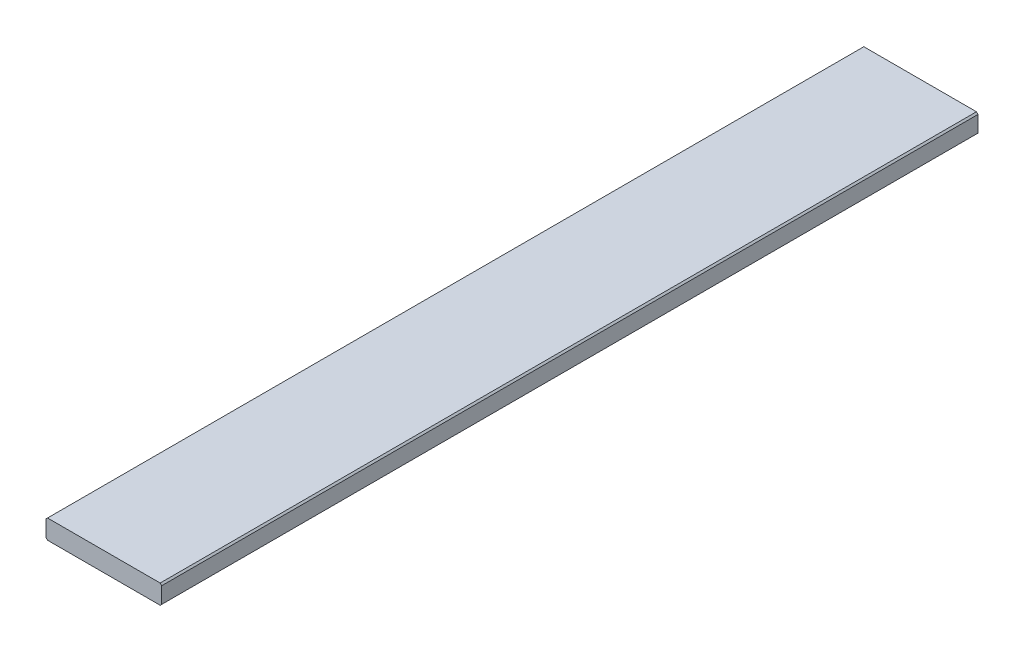
ISO-10303-21;
HEADER;
FILE_DESCRIPTION(('STEP AP214'),'2;1');
FILE_NAME('part.step','',(''),(''),'','','');
FILE_SCHEMA(('AUTOMOTIVE_DESIGN { 1 0 10303 214 1 1 1 1 }'));
ENDSEC;
DATA;
#1=APPLICATION_CONTEXT('core data for automotive mechanical design processes');
#2=APPLICATION_PROTOCOL_DEFINITION('international standard','automotive_design',2000,#1);
#3=PRODUCT_CONTEXT('',#1,'mechanical');
#4=PRODUCT('Part','Part','',(#3));
#5=PRODUCT_RELATED_PRODUCT_CATEGORY('part','',(#4));
#6=PRODUCT_DEFINITION_FORMATION('','',#4);
#7=PRODUCT_DEFINITION_CONTEXT('part definition',#1,'design');
#8=PRODUCT_DEFINITION('design','',#6,#7);
#9=PRODUCT_DEFINITION_SHAPE('','',#8);
#10=(LENGTH_UNIT() NAMED_UNIT(*) SI_UNIT(.MILLI.,.METRE.));
#11=(NAMED_UNIT(*) PLANE_ANGLE_UNIT() SI_UNIT($,.RADIAN.));
#12=(NAMED_UNIT(*) SI_UNIT($,.STERADIAN.) SOLID_ANGLE_UNIT());
#13=UNCERTAINTY_MEASURE_WITH_UNIT(LENGTH_MEASURE(1.E-05),#10,'distance_accuracy_value','');
#14=(GEOMETRIC_REPRESENTATION_CONTEXT(3) GLOBAL_UNCERTAINTY_ASSIGNED_CONTEXT((#13)) GLOBAL_UNIT_ASSIGNED_CONTEXT((#10,
#11,#12)) REPRESENTATION_CONTEXT('',''));
#15=CARTESIAN_POINT('',(0.,0.,0.));
#16=DIRECTION('',(0.,0.,1.));
#17=DIRECTION('',(1.,0.,0.));
#18=AXIS2_PLACEMENT_3D('',#15,#16,#17);
#19=CARTESIAN_POINT('',(-73.,12.5,1058.));
#20=DIRECTION('',(0.,-1.,0.));
#21=DIRECTION('',(0.,0.,-1.));
#22=AXIS2_PLACEMENT_3D('',#19,#20,#21);
#23=PLANE('',#22);
#24=DIRECTION('',(-1.,0.,0.));
#25=VECTOR('',#24,1.);
#26=CARTESIAN_POINT('',(-73.,12.5,0.));
#27=LINE('',#26,#25);
#28=CARTESIAN_POINT('',(73.,12.5,0.));
#29=VERTEX_POINT('',#28);
#30=CARTESIAN_POINT('',(-73.,12.5,0.));
#31=VERTEX_POINT('',#30);
#32=EDGE_CURVE('E130',#29,#31,#27,.T.);
#33=ORIENTED_EDGE('',*,*,#32,.T.);
#34=DIRECTION('',(0.,0.,-1.));
#35=VECTOR('',#34,1.);
#36=CARTESIAN_POINT('',(-73.,12.5,1058.));
#37=LINE('',#36,#35);
#38=CARTESIAN_POINT('',(-73.,12.5,1058.));
#39=VERTEX_POINT('',#38);
#40=EDGE_CURVE('E11',#39,#31,#37,.T.);
#41=ORIENTED_EDGE('',*,*,#40,.F.);
#42=DIRECTION('',(-1.,0.,0.));
#43=VECTOR('',#42,1.);
#44=CARTESIAN_POINT('',(-73.,12.5,1058.));
#45=LINE('',#44,#43);
#46=CARTESIAN_POINT('',(73.,12.5,1058.));
#47=VERTEX_POINT('',#46);
#48=EDGE_CURVE('E144',#47,#39,#45,.T.);
#49=ORIENTED_EDGE('',*,*,#48,.F.);
#50=DIRECTION('',(0.,0.,-1.));
#51=VECTOR('',#50,1.);
#52=CARTESIAN_POINT('',(73.,12.5,1058.));
#53=LINE('',#52,#51);
#54=EDGE_CURVE('E126',#47,#29,#53,.T.);
#55=ORIENTED_EDGE('',*,*,#54,.T.);
#56=EDGE_LOOP('',(#33,#41,#49,#55));
#57=FACE_BOUND('',#56,.T.);
#58=ADVANCED_FACE('F34',(#57),#23,.F.);
#59=CARTESIAN_POINT('',(-75.,10.5,1058.));
#60=DIRECTION('',(0.707106781186547,-0.707106781186548,0.));
#61=DIRECTION('',(0.707106781186548,0.707106781186547,0.));
#62=AXIS2_PLACEMENT_3D('',#59,#60,#61);
#63=PLANE('',#62);
#64=DIRECTION('',(-0.707106781186548,-0.707106781186547,0.));
#65=VECTOR('',#64,1.);
#66=CARTESIAN_POINT('',(-75.,10.5,0.));
#67=LINE('',#66,#65);
#68=CARTESIAN_POINT('',(-75.,10.5,0.));
#69=VERTEX_POINT('',#68);
#70=EDGE_CURVE('E133',#31,#69,#67,.T.);
#71=ORIENTED_EDGE('',*,*,#70,.T.);
#72=DIRECTION('',(0.,0.,-1.));
#73=VECTOR('',#72,1.);
#74=CARTESIAN_POINT('',(-75.,10.5,1058.));
#75=LINE('',#74,#73);
#76=CARTESIAN_POINT('',(-75.,10.5,1058.));
#77=VERTEX_POINT('',#76);
#78=EDGE_CURVE('E42',#77,#69,#75,.T.);
#79=ORIENTED_EDGE('',*,*,#78,.F.);
#80=DIRECTION('',(-0.707106781186548,-0.707106781186547,0.));
#81=VECTOR('',#80,1.);
#82=CARTESIAN_POINT('',(-75.,10.5,1058.));
#83=LINE('',#82,#81);
#84=EDGE_CURVE('E93',#39,#77,#83,.T.);
#85=ORIENTED_EDGE('',*,*,#84,.F.);
#86=ORIENTED_EDGE('',*,*,#40,.T.);
#87=EDGE_LOOP('',(#71,#79,#85,#86));
#88=FACE_BOUND('',#87,.T.);
#89=ADVANCED_FACE('F179',(#88),#63,.F.);
#90=CARTESIAN_POINT('',(-75.,10.5,1058.));
#91=DIRECTION('',(1.,0.,0.));
#92=DIRECTION('',(0.,0.,-1.));
#93=AXIS2_PLACEMENT_3D('',#90,#91,#92);
#94=PLANE('',#93);
#95=DIRECTION('',(0.,-1.,0.));
#96=VECTOR('',#95,1.);
#97=CARTESIAN_POINT('',(-75.,10.5,0.));
#98=LINE('',#97,#96);
#99=CARTESIAN_POINT('',(-75.,-10.5,0.));
#100=VERTEX_POINT('',#99);
#101=EDGE_CURVE('E135',#69,#100,#98,.T.);
#102=ORIENTED_EDGE('',*,*,#101,.T.);
#103=DIRECTION('',(0.,0.,-1.));
#104=VECTOR('',#103,1.);
#105=CARTESIAN_POINT('',(-75.,-10.5,1058.));
#106=LINE('',#105,#104);
#107=CARTESIAN_POINT('',(-75.,-10.5,1058.));
#108=VERTEX_POINT('',#107);
#109=EDGE_CURVE('E151',#108,#100,#106,.T.);
#110=ORIENTED_EDGE('',*,*,#109,.F.);
#111=DIRECTION('',(0.,-1.,0.));
#112=VECTOR('',#111,1.);
#113=CARTESIAN_POINT('',(-75.,10.5,1058.));
#114=LINE('',#113,#112);
#115=EDGE_CURVE('E159',#77,#108,#114,.T.);
#116=ORIENTED_EDGE('',*,*,#115,.F.);
#117=ORIENTED_EDGE('',*,*,#78,.T.);
#118=EDGE_LOOP('',(#102,#110,#116,#117));
#119=FACE_BOUND('',#118,.T.);
#120=ADVANCED_FACE('F157',(#119),#94,.F.);
#121=CARTESIAN_POINT('',(-75.,-10.5,1058.));
#122=DIRECTION('',(0.707106781186547,0.707106781186548,0.));
#123=DIRECTION('',(-0.707106781186548,0.707106781186547,0.));
#124=AXIS2_PLACEMENT_3D('',#121,#122,#123);
#125=PLANE('',#124);
#126=DIRECTION('',(0.707106781186548,-0.707106781186547,0.));
#127=VECTOR('',#126,1.);
#128=CARTESIAN_POINT('',(-75.,-10.5,0.));
#129=LINE('',#128,#127);
#130=CARTESIAN_POINT('',(-73.,-12.5,0.));
#131=VERTEX_POINT('',#130);
#132=EDGE_CURVE('E137',#100,#131,#129,.T.);
#133=ORIENTED_EDGE('',*,*,#132,.T.);
#134=DIRECTION('',(0.,0.,-1.));
#135=VECTOR('',#134,1.);
#136=CARTESIAN_POINT('',(-73.,-12.5,1058.));
#137=LINE('',#136,#135);
#138=CARTESIAN_POINT('',(-73.,-12.5,1058.));
#139=VERTEX_POINT('',#138);
#140=EDGE_CURVE('E148',#139,#131,#137,.T.);
#141=ORIENTED_EDGE('',*,*,#140,.F.);
#142=DIRECTION('',(0.707106781186548,-0.707106781186547,0.));
#143=VECTOR('',#142,1.);
#144=CARTESIAN_POINT('',(-75.,-10.5,1058.));
#145=LINE('',#144,#143);
#146=EDGE_CURVE('E171',#108,#139,#145,.T.);
#147=ORIENTED_EDGE('',*,*,#146,.F.);
#148=ORIENTED_EDGE('',*,*,#109,.T.);
#149=EDGE_LOOP('',(#133,#141,#147,#148));
#150=FACE_BOUND('',#149,.T.);
#151=ADVANCED_FACE('F167',(#150),#125,.F.);
#152=CARTESIAN_POINT('',(-73.,-12.5,1058.));
#153=DIRECTION('',(0.,1.,0.));
#154=DIRECTION('',(0.,0.,1.));
#155=AXIS2_PLACEMENT_3D('',#152,#153,#154);
#156=PLANE('',#155);
#157=DIRECTION('',(1.,0.,0.));
#158=VECTOR('',#157,1.);
#159=CARTESIAN_POINT('',(-73.,-12.5,0.));
#160=LINE('',#159,#158);
#161=CARTESIAN_POINT('',(73.,-12.5,0.));
#162=VERTEX_POINT('',#161);
#163=EDGE_CURVE('E139',#131,#162,#160,.T.);
#164=ORIENTED_EDGE('',*,*,#163,.T.);
#165=DIRECTION('',(0.,0.,-1.));
#166=VECTOR('',#165,1.);
#167=CARTESIAN_POINT('',(73.,-12.5,1058.));
#168=LINE('',#167,#166);
#169=CARTESIAN_POINT('',(73.,-12.5,1058.));
#170=VERTEX_POINT('',#169);
#171=EDGE_CURVE('E121',#170,#162,#168,.T.);
#172=ORIENTED_EDGE('',*,*,#171,.F.);
#173=DIRECTION('',(1.,0.,0.));
#174=VECTOR('',#173,1.);
#175=CARTESIAN_POINT('',(-73.,-12.5,1058.));
#176=LINE('',#175,#174);
#177=EDGE_CURVE('E112',#139,#170,#176,.T.);
#178=ORIENTED_EDGE('',*,*,#177,.F.);
#179=ORIENTED_EDGE('',*,*,#140,.T.);
#180=EDGE_LOOP('',(#164,#172,#178,#179));
#181=FACE_BOUND('',#180,.T.);
#182=ADVANCED_FACE('F170',(#181),#156,.F.);
#183=CARTESIAN_POINT('',(73.,-12.5,1058.));
#184=DIRECTION('',(-0.707106781186547,0.707106781186548,0.));
#185=DIRECTION('',(-0.707106781186548,-0.707106781186547,0.));
#186=AXIS2_PLACEMENT_3D('',#183,#184,#185);
#187=PLANE('',#186);
#188=DIRECTION('',(0.707106781186548,0.707106781186547,0.));
#189=VECTOR('',#188,1.);
#190=CARTESIAN_POINT('',(73.,-12.5,0.));
#191=LINE('',#190,#189);
#192=CARTESIAN_POINT('',(75.,-10.5,0.));
#193=VERTEX_POINT('',#192);
#194=EDGE_CURVE('E120',#162,#193,#191,.T.);
#195=ORIENTED_EDGE('',*,*,#194,.T.);
#196=DIRECTION('',(0.,0.,-1.));
#197=VECTOR('',#196,1.);
#198=CARTESIAN_POINT('',(75.,-10.5,1058.));
#199=LINE('',#198,#197);
#200=CARTESIAN_POINT('',(75.,-10.5,1058.));
#201=VERTEX_POINT('',#200);
#202=EDGE_CURVE('E117',#201,#193,#199,.T.);
#203=ORIENTED_EDGE('',*,*,#202,.F.);
#204=DIRECTION('',(0.707106781186548,0.707106781186547,0.));
#205=VECTOR('',#204,1.);
#206=CARTESIAN_POINT('',(73.,-12.5,1058.));
#207=LINE('',#206,#205);
#208=EDGE_CURVE('E106',#170,#201,#207,.T.);
#209=ORIENTED_EDGE('',*,*,#208,.F.);
#210=ORIENTED_EDGE('',*,*,#171,.T.);
#211=EDGE_LOOP('',(#195,#203,#209,#210));
#212=FACE_BOUND('',#211,.T.);
#213=ADVANCED_FACE('F118',(#212),#187,.F.);
#214=CARTESIAN_POINT('',(75.,10.5,1058.));
#215=DIRECTION('',(-1.,0.,0.));
#216=DIRECTION('',(0.,0.,1.));
#217=AXIS2_PLACEMENT_3D('',#214,#215,#216);
#218=PLANE('',#217);
#219=DIRECTION('',(0.,1.,0.));
#220=VECTOR('',#219,1.);
#221=CARTESIAN_POINT('',(75.,10.5,0.));
#222=LINE('',#221,#220);
#223=CARTESIAN_POINT('',(75.,10.5,0.));
#224=VERTEX_POINT('',#223);
#225=EDGE_CURVE('E79',#193,#224,#222,.T.);
#226=ORIENTED_EDGE('',*,*,#225,.T.);
#227=DIRECTION('',(0.,0.,-1.));
#228=VECTOR('',#227,1.);
#229=CARTESIAN_POINT('',(75.,10.5,1058.));
#230=LINE('',#229,#228);
#231=CARTESIAN_POINT('',(75.,10.5,1058.));
#232=VERTEX_POINT('',#231);
#233=EDGE_CURVE('E122',#232,#224,#230,.T.);
#234=ORIENTED_EDGE('',*,*,#233,.F.);
#235=DIRECTION('',(0.,1.,0.));
#236=VECTOR('',#235,1.);
#237=CARTESIAN_POINT('',(75.,10.5,1058.));
#238=LINE('',#237,#236);
#239=EDGE_CURVE('E110',#201,#232,#238,.T.);
#240=ORIENTED_EDGE('',*,*,#239,.F.);
#241=ORIENTED_EDGE('',*,*,#202,.T.);
#242=EDGE_LOOP('',(#226,#234,#240,#241));
#243=FACE_BOUND('',#242,.T.);
#244=ADVANCED_FACE('F124',(#243),#218,.F.);
#245=CARTESIAN_POINT('',(73.,12.5,1058.));
#246=DIRECTION('',(-0.707106781186547,-0.707106781186548,0.));
#247=DIRECTION('',(0.707106781186548,-0.707106781186547,0.));
#248=AXIS2_PLACEMENT_3D('',#245,#246,#247);
#249=PLANE('',#248);
#250=DIRECTION('',(-0.707106781186548,0.707106781186547,0.));
#251=VECTOR('',#250,1.);
#252=CARTESIAN_POINT('',(73.,12.5,0.));
#253=LINE('',#252,#251);
#254=EDGE_CURVE('E85',#224,#29,#253,.T.);
#255=ORIENTED_EDGE('',*,*,#254,.T.);
#256=ORIENTED_EDGE('',*,*,#54,.F.);
#257=DIRECTION('',(-0.707106781186548,0.707106781186547,0.));
#258=VECTOR('',#257,1.);
#259=CARTESIAN_POINT('',(73.,12.5,1058.));
#260=LINE('',#259,#258);
#261=EDGE_CURVE('E50',#232,#47,#260,.T.);
#262=ORIENTED_EDGE('',*,*,#261,.F.);
#263=ORIENTED_EDGE('',*,*,#233,.T.);
#264=EDGE_LOOP('',(#255,#256,#262,#263));
#265=FACE_BOUND('',#264,.T.);
#266=ADVANCED_FACE('F195',(#265),#249,.F.);
#267=CARTESIAN_POINT('',(0.,0.,1058.));
#268=DIRECTION('',(0.,0.,-1.));
#269=DIRECTION('',(-1.,0.,0.));
#270=AXIS2_PLACEMENT_3D('',#267,#268,#269);
#271=PLANE('',#270);
#272=ORIENTED_EDGE('',*,*,#48,.T.);
#273=ORIENTED_EDGE('',*,*,#84,.T.);
#274=ORIENTED_EDGE('',*,*,#115,.T.);
#275=ORIENTED_EDGE('',*,*,#146,.T.);
#276=ORIENTED_EDGE('',*,*,#177,.T.);
#277=ORIENTED_EDGE('',*,*,#208,.T.);
#278=ORIENTED_EDGE('',*,*,#239,.T.);
#279=ORIENTED_EDGE('',*,*,#261,.T.);
#280=EDGE_LOOP('',(#272,#273,#274,#275,#276,#277,#278,#279));
#281=FACE_BOUND('',#280,.T.);
#282=ADVANCED_FACE('F108',(#281),#271,.F.);
#283=CARTESIAN_POINT('',(0.,0.,0.));
#284=DIRECTION('',(0.,0.,-1.));
#285=DIRECTION('',(-1.,0.,0.));
#286=AXIS2_PLACEMENT_3D('',#283,#284,#285);
#287=PLANE('',#286);
#288=ORIENTED_EDGE('',*,*,#32,.F.);
#289=ORIENTED_EDGE('',*,*,#254,.F.);
#290=ORIENTED_EDGE('',*,*,#225,.F.);
#291=ORIENTED_EDGE('',*,*,#194,.F.);
#292=ORIENTED_EDGE('',*,*,#163,.F.);
#293=ORIENTED_EDGE('',*,*,#132,.F.);
#294=ORIENTED_EDGE('',*,*,#101,.F.);
#295=ORIENTED_EDGE('',*,*,#70,.F.);
#296=EDGE_LOOP('',(#288,#289,#290,#291,#292,#293,#294,#295));
#297=FACE_BOUND('',#296,.T.);
#298=ADVANCED_FACE('F163',(#297),#287,.T.);
#299=CLOSED_SHELL('',(#58,#89,#120,#151,#182,#213,#244,#266,#282,#298));
#300=MANIFOLD_SOLID_BREP('B2',#299);
#301=ADVANCED_BREP_SHAPE_REPRESENTATION('',(#18,#300),#14);
#302=SHAPE_DEFINITION_REPRESENTATION(#9,#301);
ENDSEC;
END-ISO-10303-21;
